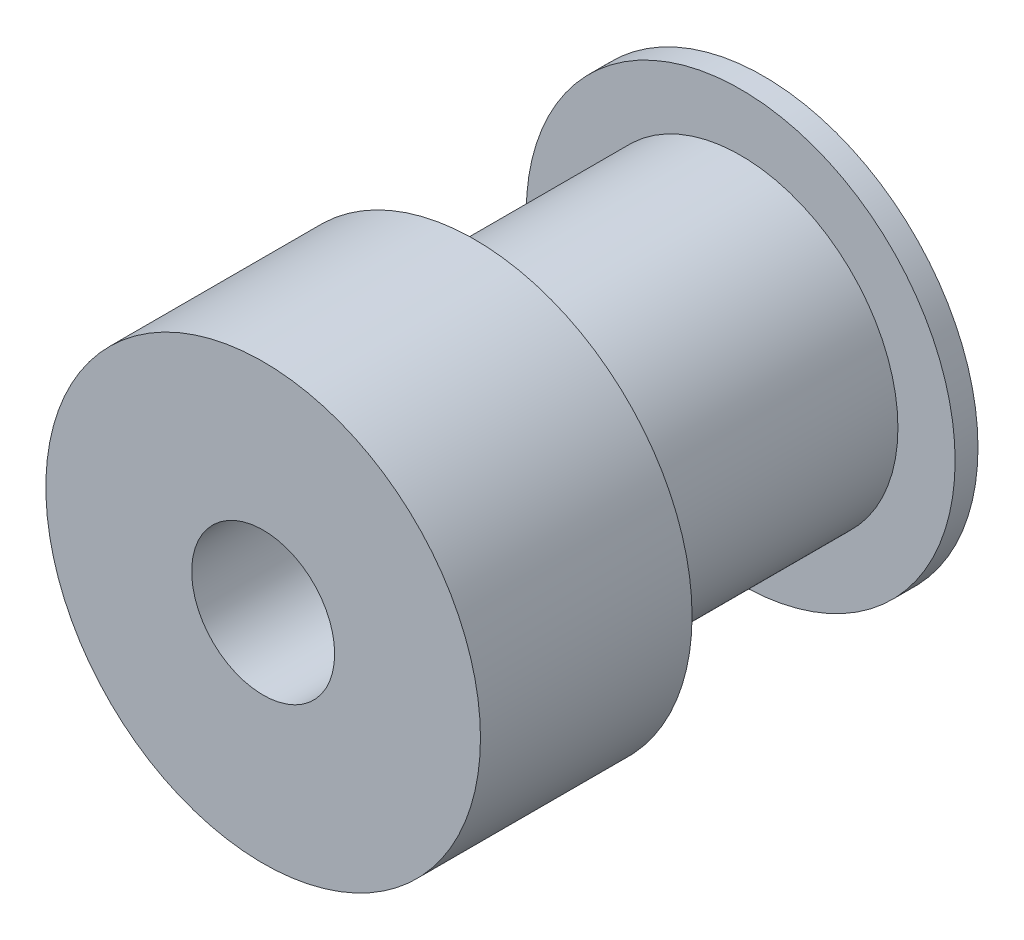
ISO-10303-21;
HEADER;
FILE_DESCRIPTION(('STEP AP214'),'2;1');
FILE_NAME('part.step','',(''),(''),'','','');
FILE_SCHEMA(('AUTOMOTIVE_DESIGN { 1 0 10303 214 1 1 1 1 }'));
ENDSEC;
DATA;
#1=APPLICATION_CONTEXT('core data for automotive mechanical design processes');
#2=APPLICATION_PROTOCOL_DEFINITION('international standard','automotive_design',2000,#1);
#3=PRODUCT_CONTEXT('',#1,'mechanical');
#4=PRODUCT('Part','Part','',(#3));
#5=PRODUCT_RELATED_PRODUCT_CATEGORY('part','',(#4));
#6=PRODUCT_DEFINITION_FORMATION('','',#4);
#7=PRODUCT_DEFINITION_CONTEXT('part definition',#1,'design');
#8=PRODUCT_DEFINITION('design','',#6,#7);
#9=PRODUCT_DEFINITION_SHAPE('','',#8);
#10=(LENGTH_UNIT() NAMED_UNIT(*) SI_UNIT(.MILLI.,.METRE.));
#11=(NAMED_UNIT(*) PLANE_ANGLE_UNIT() SI_UNIT($,.RADIAN.));
#12=(NAMED_UNIT(*) SI_UNIT($,.STERADIAN.) SOLID_ANGLE_UNIT());
#13=UNCERTAINTY_MEASURE_WITH_UNIT(LENGTH_MEASURE(1.E-05),#10,'distance_accuracy_value','');
#14=(GEOMETRIC_REPRESENTATION_CONTEXT(3) GLOBAL_UNCERTAINTY_ASSIGNED_CONTEXT((#13)) GLOBAL_UNIT_ASSIGNED_CONTEXT((#10,
#11,#12)) REPRESENTATION_CONTEXT('',''));
#15=CARTESIAN_POINT('',(0.,0.,0.));
#16=DIRECTION('',(0.,0.,1.));
#17=DIRECTION('',(1.,0.,0.));
#18=AXIS2_PLACEMENT_3D('',#15,#16,#17);
#19=CARTESIAN_POINT('',(0.,0.,0.8));
#20=DIRECTION('',(0.,0.,1.));
#21=DIRECTION('',(1.,0.,0.));
#22=AXIS2_PLACEMENT_3D('',#19,#20,#21);
#23=PLANE('',#22);
#24=CARTESIAN_POINT('',(0.,0.,0.8));
#25=DIRECTION('',(0.,0.,1.));
#26=DIRECTION('',(1.,0.,0.));
#27=AXIS2_PLACEMENT_3D('',#24,#25,#26);
#28=CIRCLE('',#27,7.5);
#29=CARTESIAN_POINT('',(7.5,0.,0.8));
#30=VERTEX_POINT('',#29);
#31=EDGE_CURVE('E10',#30,#30,#28,.T.);
#32=ORIENTED_EDGE('',*,*,#31,.T.);
#33=EDGE_LOOP('',(#32));
#34=FACE_BOUND('',#33,.T.);
#35=CARTESIAN_POINT('',(0.,0.,0.8));
#36=DIRECTION('',(0.,0.,1.));
#37=DIRECTION('',(1.,0.,0.));
#38=AXIS2_PLACEMENT_3D('',#35,#36,#37);
#39=CIRCLE('',#38,5.5);
#40=CARTESIAN_POINT('',(5.5,0.,0.8));
#41=VERTEX_POINT('',#40);
#42=EDGE_CURVE('E46',#41,#41,#39,.T.);
#43=ORIENTED_EDGE('',*,*,#42,.F.);
#44=EDGE_LOOP('',(#43));
#45=FACE_BOUND('',#44,.T.);
#46=ADVANCED_FACE('F33',(#34,#45),#23,.T.);
#47=CARTESIAN_POINT('',(0.,0.,0.8));
#48=DIRECTION('',(0.,0.,-1.));
#49=DIRECTION('',(-1.,0.,0.));
#50=AXIS2_PLACEMENT_3D('',#47,#48,#49);
#51=CYLINDRICAL_SURFACE('',#50,7.5);
#52=ORIENTED_EDGE('',*,*,#31,.F.);
#53=EDGE_LOOP('',(#52));
#54=FACE_BOUND('',#53,.T.);
#55=CARTESIAN_POINT('',(0.,0.,0.));
#56=DIRECTION('',(0.,0.,1.));
#57=DIRECTION('',(1.,0.,0.));
#58=AXIS2_PLACEMENT_3D('',#55,#56,#57);
#59=CIRCLE('',#58,7.5);
#60=CARTESIAN_POINT('',(7.5,0.,0.));
#61=VERTEX_POINT('',#60);
#62=EDGE_CURVE('E37',#61,#61,#59,.T.);
#63=ORIENTED_EDGE('',*,*,#62,.T.);
#64=EDGE_LOOP('',(#63));
#65=FACE_BOUND('',#64,.T.);
#66=ADVANCED_FACE('F35',(#54,#65),#51,.T.);
#67=CARTESIAN_POINT('',(0.,0.,0.));
#68=DIRECTION('',(0.,0.,1.));
#69=DIRECTION('',(1.,0.,0.));
#70=AXIS2_PLACEMENT_3D('',#67,#68,#69);
#71=PLANE('',#70);
#72=CARTESIAN_POINT('',(0.,0.,0.));
#73=DIRECTION('',(0.,0.,1.));
#74=DIRECTION('',(1.,0.,0.));
#75=AXIS2_PLACEMENT_3D('',#72,#73,#74);
#76=CIRCLE('',#75,2.5);
#77=CARTESIAN_POINT('',(2.5,0.,0.));
#78=VERTEX_POINT('',#77);
#79=EDGE_CURVE('E55',#78,#78,#76,.T.);
#80=ORIENTED_EDGE('',*,*,#79,.T.);
#81=EDGE_LOOP('',(#80));
#82=FACE_BOUND('',#81,.T.);
#83=ORIENTED_EDGE('',*,*,#62,.F.);
#84=EDGE_LOOP('',(#83));
#85=FACE_BOUND('',#84,.T.);
#86=ADVANCED_FACE('F64',(#82,#85),#71,.F.);
#87=CARTESIAN_POINT('',(0.,0.,10.1));
#88=DIRECTION('',(0.,0.,-1.));
#89=DIRECTION('',(-1.,0.,0.));
#90=AXIS2_PLACEMENT_3D('',#87,#88,#89);
#91=CYLINDRICAL_SURFACE('',#90,5.5);
#92=CARTESIAN_POINT('',(0.,0.,10.1));
#93=DIRECTION('',(0.,0.,1.));
#94=DIRECTION('',(1.,0.,0.));
#95=AXIS2_PLACEMENT_3D('',#92,#93,#94);
#96=CIRCLE('',#95,5.5);
#97=CARTESIAN_POINT('',(5.5,0.,10.1));
#98=VERTEX_POINT('',#97);
#99=EDGE_CURVE('E44',#98,#98,#96,.T.);
#100=ORIENTED_EDGE('',*,*,#99,.F.);
#101=EDGE_LOOP('',(#100));
#102=FACE_BOUND('',#101,.T.);
#103=ORIENTED_EDGE('',*,*,#42,.T.);
#104=EDGE_LOOP('',(#103));
#105=FACE_BOUND('',#104,.T.);
#106=ADVANCED_FACE('F88',(#102,#105),#91,.T.);
#107=CARTESIAN_POINT('',(0.,0.,10.1));
#108=DIRECTION('',(0.,0.,1.));
#109=DIRECTION('',(1.,0.,0.));
#110=AXIS2_PLACEMENT_3D('',#107,#108,#109);
#111=PLANE('',#110);
#112=CARTESIAN_POINT('',(0.,0.,10.1));
#113=DIRECTION('',(0.,0.,1.));
#114=DIRECTION('',(1.,0.,0.));
#115=AXIS2_PLACEMENT_3D('',#112,#113,#114);
#116=CIRCLE('',#115,7.6);
#117=CARTESIAN_POINT('',(7.6,0.,10.1));
#118=VERTEX_POINT('',#117);
#119=EDGE_CURVE('E52',#118,#118,#116,.T.);
#120=ORIENTED_EDGE('',*,*,#119,.F.);
#121=EDGE_LOOP('',(#120));
#122=FACE_BOUND('',#121,.T.);
#123=ORIENTED_EDGE('',*,*,#99,.T.);
#124=EDGE_LOOP('',(#123));
#125=FACE_BOUND('',#124,.T.);
#126=ADVANCED_FACE('F82',(#122,#125),#111,.F.);
#127=CARTESIAN_POINT('',(0.,0.,17.5));
#128=DIRECTION('',(0.,0.,-1.));
#129=DIRECTION('',(-1.,0.,0.));
#130=AXIS2_PLACEMENT_3D('',#127,#128,#129);
#131=CYLINDRICAL_SURFACE('',#130,7.6);
#132=CARTESIAN_POINT('',(0.,0.,17.5));
#133=DIRECTION('',(0.,0.,1.));
#134=DIRECTION('',(1.,0.,0.));
#135=AXIS2_PLACEMENT_3D('',#132,#133,#134);
#136=CIRCLE('',#135,7.6);
#137=CARTESIAN_POINT('',(7.6,0.,17.5));
#138=VERTEX_POINT('',#137);
#139=EDGE_CURVE('E49',#138,#138,#136,.T.);
#140=ORIENTED_EDGE('',*,*,#139,.F.);
#141=EDGE_LOOP('',(#140));
#142=FACE_BOUND('',#141,.T.);
#143=ORIENTED_EDGE('',*,*,#119,.T.);
#144=EDGE_LOOP('',(#143));
#145=FACE_BOUND('',#144,.T.);
#146=ADVANCED_FACE('F76',(#142,#145),#131,.T.);
#147=CARTESIAN_POINT('',(0.,0.,17.5));
#148=DIRECTION('',(0.,0.,1.));
#149=DIRECTION('',(1.,0.,0.));
#150=AXIS2_PLACEMENT_3D('',#147,#148,#149);
#151=PLANE('',#150);
#152=CARTESIAN_POINT('',(0.,0.,17.5));
#153=DIRECTION('',(0.,0.,1.));
#154=DIRECTION('',(1.,0.,0.));
#155=AXIS2_PLACEMENT_3D('',#152,#153,#154);
#156=CIRCLE('',#155,2.5);
#157=CARTESIAN_POINT('',(2.5,0.,17.5));
#158=VERTEX_POINT('',#157);
#159=EDGE_CURVE('E58',#158,#158,#156,.T.);
#160=ORIENTED_EDGE('',*,*,#159,.F.);
#161=EDGE_LOOP('',(#160));
#162=FACE_BOUND('',#161,.T.);
#163=ORIENTED_EDGE('',*,*,#139,.T.);
#164=EDGE_LOOP('',(#163));
#165=FACE_BOUND('',#164,.T.);
#166=ADVANCED_FACE('F70',(#162,#165),#151,.T.);
#167=CARTESIAN_POINT('',(0.,0.,0.));
#168=DIRECTION('',(0.,0.,1.));
#169=DIRECTION('',(1.,0.,0.));
#170=AXIS2_PLACEMENT_3D('',#167,#168,#169);
#171=CYLINDRICAL_SURFACE('',#170,2.5);
#172=ORIENTED_EDGE('',*,*,#79,.F.);
#173=EDGE_LOOP('',(#172));
#174=FACE_BOUND('',#173,.T.);
#175=ORIENTED_EDGE('',*,*,#159,.T.);
#176=EDGE_LOOP('',(#175));
#177=FACE_BOUND('',#176,.T.);
#178=ADVANCED_FACE('F67',(#174,#177),#171,.F.);
#179=CLOSED_SHELL('',(#46,#66,#86,#106,#126,#146,#166,#178));
#180=MANIFOLD_SOLID_BREP('B2',#179);
#181=ADVANCED_BREP_SHAPE_REPRESENTATION('',(#18,#180),#14);
#182=SHAPE_DEFINITION_REPRESENTATION(#9,#181);
ENDSEC;
END-ISO-10303-21;
